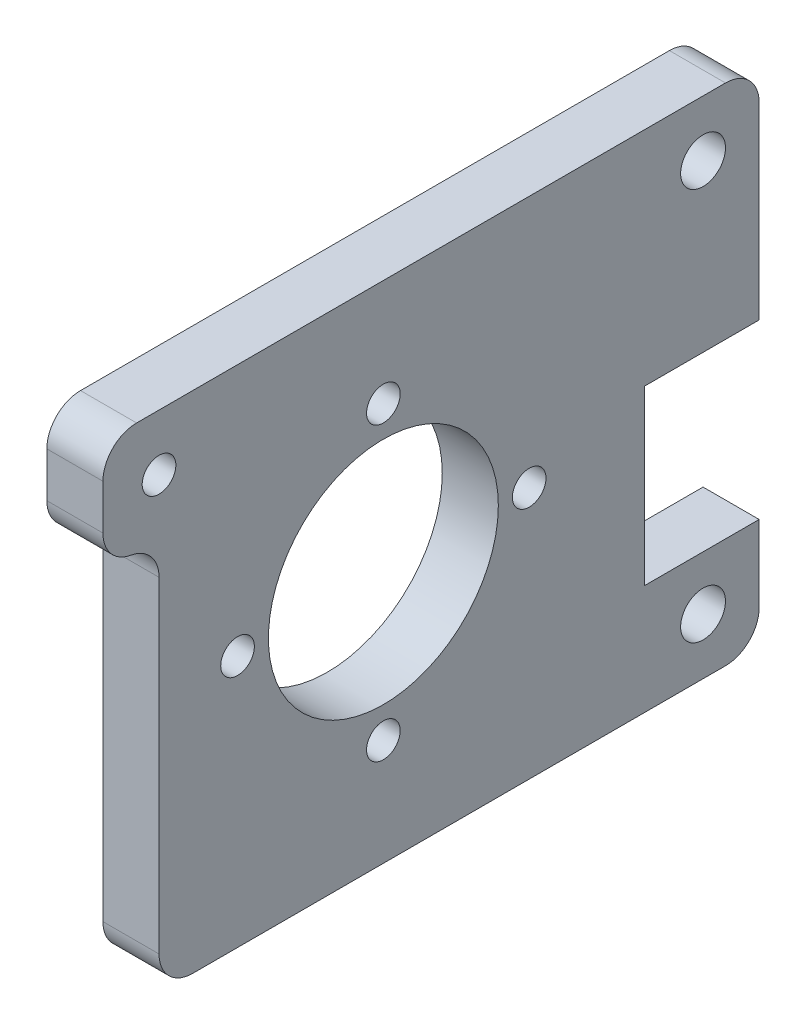
ISO-10303-21;
HEADER;
FILE_DESCRIPTION(('STEP AP214'),'2;1');
FILE_NAME('part.step','',(''),(''),'','','');
FILE_SCHEMA(('AUTOMOTIVE_DESIGN { 1 0 10303 214 1 1 1 1 }'));
ENDSEC;
DATA;
#1=APPLICATION_CONTEXT('core data for automotive mechanical design processes');
#2=APPLICATION_PROTOCOL_DEFINITION('international standard','automotive_design',2000,#1);
#3=PRODUCT_CONTEXT('',#1,'mechanical');
#4=PRODUCT('Part','Part','',(#3));
#5=PRODUCT_RELATED_PRODUCT_CATEGORY('part','',(#4));
#6=PRODUCT_DEFINITION_FORMATION('','',#4);
#7=PRODUCT_DEFINITION_CONTEXT('part definition',#1,'design');
#8=PRODUCT_DEFINITION('design','',#6,#7);
#9=PRODUCT_DEFINITION_SHAPE('','',#8);
#10=(LENGTH_UNIT() NAMED_UNIT(*) SI_UNIT(.MILLI.,.METRE.));
#11=(NAMED_UNIT(*) PLANE_ANGLE_UNIT() SI_UNIT($,.RADIAN.));
#12=(NAMED_UNIT(*) SI_UNIT($,.STERADIAN.) SOLID_ANGLE_UNIT());
#13=UNCERTAINTY_MEASURE_WITH_UNIT(LENGTH_MEASURE(1.E-05),#10,'distance_accuracy_value','');
#14=(GEOMETRIC_REPRESENTATION_CONTEXT(3) GLOBAL_UNCERTAINTY_ASSIGNED_CONTEXT((#13)) GLOBAL_UNIT_ASSIGNED_CONTEXT((#10,
#11,#12)) REPRESENTATION_CONTEXT('',''));
#15=CARTESIAN_POINT('',(0.,0.,0.));
#16=DIRECTION('',(0.,0.,1.));
#17=DIRECTION('',(1.,0.,0.));
#18=AXIS2_PLACEMENT_3D('',#15,#16,#17);
#19=CARTESIAN_POINT('',(5.,-22.5,-26.75));
#20=DIRECTION('',(0.,0.,1.));
#21=DIRECTION('',(1.,0.,0.));
#22=AXIS2_PLACEMENT_3D('',#19,#20,#21);
#23=PLANE('',#22);
#24=DIRECTION('',(0.,1.,0.));
#25=VECTOR('',#24,1.);
#26=CARTESIAN_POINT('',(5.,-22.5,-26.75));
#27=LINE('',#26,#25);
#28=CARTESIAN_POINT('',(5.,-19.5,-26.75));
#29=VERTEX_POINT('',#28);
#30=CARTESIAN_POINT('',(5.,-12.7,-26.75));
#31=VERTEX_POINT('',#30);
#32=EDGE_CURVE('E228',#29,#31,#27,.T.);
#33=ORIENTED_EDGE('',*,*,#32,.F.);
#34=DIRECTION('',(-1.,0.,0.));
#35=VECTOR('',#34,1.);
#36=CARTESIAN_POINT('',(5.,-19.5,-26.75));
#37=LINE('',#36,#35);
#38=CARTESIAN_POINT('',(0.,-19.5,-26.75));
#39=VERTEX_POINT('',#38);
#40=EDGE_CURVE('E283',#29,#39,#37,.T.);
#41=ORIENTED_EDGE('',*,*,#40,.T.);
#42=DIRECTION('',(0.,1.,0.));
#43=VECTOR('',#42,1.);
#44=CARTESIAN_POINT('',(0.,-22.5,-26.75));
#45=LINE('',#44,#43);
#46=CARTESIAN_POINT('',(0.,-12.7,-26.75));
#47=VERTEX_POINT('',#46);
#48=EDGE_CURVE('E240',#39,#47,#45,.T.);
#49=ORIENTED_EDGE('',*,*,#48,.T.);
#50=DIRECTION('',(1.,0.,0.));
#51=VECTOR('',#50,1.);
#52=CARTESIAN_POINT('',(5.,-12.7,-26.75));
#53=LINE('',#52,#51);
#54=EDGE_CURVE('E251',#47,#31,#53,.T.);
#55=ORIENTED_EDGE('',*,*,#54,.T.);
#56=EDGE_LOOP('',(#33,#41,#49,#55));
#57=FACE_BOUND('',#56,.T.);
#58=ADVANCED_FACE('F35',(#57),#23,.F.);
#59=CARTESIAN_POINT('',(5.,-22.5,26.75));
#60=DIRECTION('',(0.,0.,-1.));
#61=DIRECTION('',(-1.,0.,0.));
#62=AXIS2_PLACEMENT_3D('',#59,#60,#61);
#63=PLANE('',#62);
#64=DIRECTION('',(0.,-1.,0.));
#65=VECTOR('',#64,1.);
#66=CARTESIAN_POINT('',(5.,-22.5,26.75));
#67=LINE('',#66,#65);
#68=CARTESIAN_POINT('',(5.,9.58392021690037,26.75));
#69=VERTEX_POINT('',#68);
#70=CARTESIAN_POINT('',(5.,-19.5,26.75));
#71=VERTEX_POINT('',#70);
#72=EDGE_CURVE('E234',#69,#71,#67,.T.);
#73=ORIENTED_EDGE('',*,*,#72,.F.);
#74=DIRECTION('',(1.,0.,0.));
#75=VECTOR('',#74,1.);
#76=CARTESIAN_POINT('',(5.,9.58392021690039,26.75));
#77=LINE('',#76,#75);
#78=CARTESIAN_POINT('',(0.,9.58392021690037,26.75));
#79=VERTEX_POINT('',#78);
#80=EDGE_CURVE('E56',#69,#79,#77,.F.);
#81=ORIENTED_EDGE('',*,*,#80,.T.);
#82=DIRECTION('',(0.,-1.,0.));
#83=VECTOR('',#82,1.);
#84=CARTESIAN_POINT('',(0.,-22.5,26.75));
#85=LINE('',#84,#83);
#86=CARTESIAN_POINT('',(0.,-19.5,26.75));
#87=VERTEX_POINT('',#86);
#88=EDGE_CURVE('E245',#79,#87,#85,.T.);
#89=ORIENTED_EDGE('',*,*,#88,.T.);
#90=DIRECTION('',(-1.,0.,0.));
#91=VECTOR('',#90,1.);
#92=CARTESIAN_POINT('',(5.,-19.5,26.75));
#93=LINE('',#92,#91);
#94=EDGE_CURVE('E291',#87,#71,#93,.F.);
#95=ORIENTED_EDGE('',*,*,#94,.T.);
#96=EDGE_LOOP('',(#73,#81,#89,#95));
#97=FACE_BOUND('',#96,.T.);
#98=ADVANCED_FACE('F358',(#97),#63,.F.);
#99=CARTESIAN_POINT('',(5.,0.,0.));
#100=DIRECTION('',(-1.,0.,0.));
#101=DIRECTION('',(0.,0.,1.));
#102=AXIS2_PLACEMENT_3D('',#99,#100,#101);
#103=PLANE('',#102);
#104=CARTESIAN_POINT('',(5.,17.5,26.75));
#105=DIRECTION('',(1.,0.,0.));
#106=DIRECTION('',(0.,0.,-1.));
#107=AXIS2_PLACEMENT_3D('',#104,#105,#106);
#108=CIRCLE('',#107,1.5);
#109=CARTESIAN_POINT('',(5.,17.5,25.25));
#110=VERTEX_POINT('',#109);
#111=EDGE_CURVE('E172',#110,#110,#108,.T.);
#112=ORIENTED_EDGE('',*,*,#111,.F.);
#113=EDGE_LOOP('',(#112));
#114=FACE_BOUND('',#113,.T.);
#115=CARTESIAN_POINT('',(5.,2.7,-26.75));
#116=VERTEX_POINT('',#115);
#117=CARTESIAN_POINT('',(5.,19.5,-26.75));
#118=VERTEX_POINT('',#117);
#119=EDGE_CURVE('E231',#116,#118,#27,.T.);
#120=ORIENTED_EDGE('',*,*,#119,.T.);
#121=CARTESIAN_POINT('',(5.,19.5,-23.75));
#122=DIRECTION('',(-1.,0.,0.));
#123=DIRECTION('',(0.,0.,1.));
#124=AXIS2_PLACEMENT_3D('',#121,#122,#123);
#125=CIRCLE('',#124,3.);
#126=CARTESIAN_POINT('',(5.,22.5,-23.75));
#127=VERTEX_POINT('',#126);
#128=EDGE_CURVE('E281',#118,#127,#125,.F.);
#129=ORIENTED_EDGE('',*,*,#128,.T.);
#130=DIRECTION('',(0.,0.,1.));
#131=VECTOR('',#130,1.);
#132=CARTESIAN_POINT('',(5.,22.5,26.75));
#133=LINE('',#132,#131);
#134=CARTESIAN_POINT('',(5.,22.5,28.75));
#135=VERTEX_POINT('',#134);
#136=EDGE_CURVE('E230',#127,#135,#133,.T.);
#137=ORIENTED_EDGE('',*,*,#136,.T.);
#138=CARTESIAN_POINT('',(5.,19.5,28.75));
#139=DIRECTION('',(-1.,0.,0.));
#140=DIRECTION('',(0.,0.,1.));
#141=AXIS2_PLACEMENT_3D('',#138,#139,#140);
#142=CIRCLE('',#141,3.);
#143=CARTESIAN_POINT('',(5.,19.5,31.75));
#144=VERTEX_POINT('',#143);
#145=EDGE_CURVE('E273',#135,#144,#142,.F.);
#146=ORIENTED_EDGE('',*,*,#145,.T.);
#147=DIRECTION('',(0.,-1.,0.));
#148=VECTOR('',#147,1.);
#149=CARTESIAN_POINT('',(5.,12.5,31.75));
#150=LINE('',#149,#148);
#151=CARTESIAN_POINT('',(5.,15.5,31.75));
#152=VERTEX_POINT('',#151);
#153=EDGE_CURVE('E179',#144,#152,#150,.T.);
#154=ORIENTED_EDGE('',*,*,#153,.T.);
#155=CARTESIAN_POINT('',(5.,15.5,28.75));
#156=DIRECTION('',(-1.,0.,0.));
#157=DIRECTION('',(0.,0.,1.));
#158=AXIS2_PLACEMENT_3D('',#155,#156,#157);
#159=CIRCLE('',#158,3.);
#160=CARTESIAN_POINT('',(5.,12.5419601084502,29.25));
#161=VERTEX_POINT('',#160);
#162=EDGE_CURVE('E275',#152,#161,#159,.F.);
#163=ORIENTED_EDGE('',*,*,#162,.T.);
#164=CARTESIAN_POINT('',(5.,9.58392021690039,29.75));
#165=DIRECTION('',(-1.,0.,0.));
#166=DIRECTION('',(0.,0.,1.));
#167=AXIS2_PLACEMENT_3D('',#164,#165,#166);
#168=CIRCLE('',#167,3.);
#169=EDGE_CURVE('E43',#161,#69,#168,.T.);
#170=ORIENTED_EDGE('',*,*,#169,.T.);
#171=ORIENTED_EDGE('',*,*,#72,.T.);
#172=CARTESIAN_POINT('',(5.,-19.5,23.75));
#173=DIRECTION('',(-1.,0.,0.));
#174=DIRECTION('',(0.,0.,1.));
#175=AXIS2_PLACEMENT_3D('',#172,#173,#174);
#176=CIRCLE('',#175,3.);
#177=CARTESIAN_POINT('',(5.,-22.5,23.75));
#178=VERTEX_POINT('',#177);
#179=EDGE_CURVE('E277',#71,#178,#176,.F.);
#180=ORIENTED_EDGE('',*,*,#179,.T.);
#181=DIRECTION('',(0.,0.,-1.));
#182=VECTOR('',#181,1.);
#183=CARTESIAN_POINT('',(5.,-22.5,26.75));
#184=LINE('',#183,#182);
#185=CARTESIAN_POINT('',(5.,-22.5,-23.75));
#186=VERTEX_POINT('',#185);
#187=EDGE_CURVE('E236',#178,#186,#184,.T.);
#188=ORIENTED_EDGE('',*,*,#187,.T.);
#189=CARTESIAN_POINT('',(5.,-19.5,-23.75));
#190=DIRECTION('',(-1.,0.,0.));
#191=DIRECTION('',(0.,0.,1.));
#192=AXIS2_PLACEMENT_3D('',#189,#190,#191);
#193=CIRCLE('',#192,3.);
#194=EDGE_CURVE('E279',#186,#29,#193,.F.);
#195=ORIENTED_EDGE('',*,*,#194,.T.);
#196=ORIENTED_EDGE('',*,*,#32,.T.);
#197=DIRECTION('',(0.,0.,-1.));
#198=VECTOR('',#197,1.);
#199=CARTESIAN_POINT('',(5.,-12.7,-16.55));
#200=LINE('',#199,#198);
#201=CARTESIAN_POINT('',(5.,-12.7,-16.55));
#202=VERTEX_POINT('',#201);
#203=EDGE_CURVE('E166',#202,#31,#200,.T.);
#204=ORIENTED_EDGE('',*,*,#203,.F.);
#205=DIRECTION('',(0.,-1.,0.));
#206=VECTOR('',#205,1.);
#207=CARTESIAN_POINT('',(5.,-12.7,-16.55));
#208=LINE('',#207,#206);
#209=CARTESIAN_POINT('',(5.,2.7,-16.55));
#210=VERTEX_POINT('',#209);
#211=EDGE_CURVE('E169',#210,#202,#208,.T.);
#212=ORIENTED_EDGE('',*,*,#211,.F.);
#213=DIRECTION('',(0.,0.,1.));
#214=VECTOR('',#213,1.);
#215=CARTESIAN_POINT('',(5.,2.7,-16.55));
#216=LINE('',#215,#214);
#217=EDGE_CURVE('E146',#116,#210,#216,.T.);
#218=ORIENTED_EDGE('',*,*,#217,.F.);
#219=EDGE_LOOP('',(#120,#129,#137,#146,#154,#163,#170,#171,#180,#188,#195,#196,#204,#212,#218));
#220=FACE_BOUND('',#219,.T.);
#221=CARTESIAN_POINT('',(5.,0.,6.75000000000001));
#222=DIRECTION('',(1.,0.,0.));
#223=DIRECTION('',(0.,0.,-1.));
#224=AXIS2_PLACEMENT_3D('',#221,#222,#223);
#225=CIRCLE('',#224,10.25);
#226=CARTESIAN_POINT('',(5.,0.,-3.49999999999999));
#227=VERTEX_POINT('',#226);
#228=EDGE_CURVE('E223',#227,#227,#225,.T.);
#229=ORIENTED_EDGE('',*,*,#228,.F.);
#230=EDGE_LOOP('',(#229));
#231=FACE_BOUND('',#230,.T.);
#232=CARTESIAN_POINT('',(5.,0.,-6.24999999999999));
#233=DIRECTION('',(1.,0.,0.));
#234=DIRECTION('',(0.,0.,-1.));
#235=AXIS2_PLACEMENT_3D('',#232,#233,#234);
#236=CIRCLE('',#235,1.5);
#237=CARTESIAN_POINT('',(5.,0.,-7.74999999999999));
#238=VERTEX_POINT('',#237);
#239=EDGE_CURVE('E217',#238,#238,#236,.T.);
#240=ORIENTED_EDGE('',*,*,#239,.F.);
#241=EDGE_LOOP('',(#240));
#242=FACE_BOUND('',#241,.T.);
#243=CARTESIAN_POINT('',(5.,0.,19.75));
#244=DIRECTION('',(1.,0.,0.));
#245=DIRECTION('',(0.,0.,1.));
#246=AXIS2_PLACEMENT_3D('',#243,#244,#245);
#247=CIRCLE('',#246,1.5);
#248=CARTESIAN_POINT('',(5.,0.,21.25));
#249=VERTEX_POINT('',#248);
#250=EDGE_CURVE('E211',#249,#249,#247,.T.);
#251=ORIENTED_EDGE('',*,*,#250,.F.);
#252=EDGE_LOOP('',(#251));
#253=FACE_BOUND('',#252,.T.);
#254=CARTESIAN_POINT('',(5.,13.,6.75000000000001));
#255=DIRECTION('',(1.,0.,0.));
#256=DIRECTION('',(0.,0.,-1.));
#257=AXIS2_PLACEMENT_3D('',#254,#255,#256);
#258=CIRCLE('',#257,1.5);
#259=CARTESIAN_POINT('',(5.,13.,5.25000000000001));
#260=VERTEX_POINT('',#259);
#261=EDGE_CURVE('E205',#260,#260,#258,.T.);
#262=ORIENTED_EDGE('',*,*,#261,.F.);
#263=EDGE_LOOP('',(#262));
#264=FACE_BOUND('',#263,.T.);
#265=CARTESIAN_POINT('',(5.,17.5,-21.75));
#266=DIRECTION('',(1.,0.,0.));
#267=DIRECTION('',(0.,0.,-1.));
#268=AXIS2_PLACEMENT_3D('',#265,#266,#267);
#269=CIRCLE('',#268,2.00000000000001);
#270=CARTESIAN_POINT('',(5.,17.5,-23.75));
#271=VERTEX_POINT('',#270);
#272=EDGE_CURVE('E199',#271,#271,#269,.T.);
#273=ORIENTED_EDGE('',*,*,#272,.F.);
#274=EDGE_LOOP('',(#273));
#275=FACE_BOUND('',#274,.T.);
#276=CARTESIAN_POINT('',(5.,-17.5,-21.75));
#277=DIRECTION('',(1.,0.,0.));
#278=DIRECTION('',(0.,0.,1.));
#279=AXIS2_PLACEMENT_3D('',#276,#277,#278);
#280=CIRCLE('',#279,2.00000000000001);
#281=CARTESIAN_POINT('',(5.,-17.5,-19.75));
#282=VERTEX_POINT('',#281);
#283=EDGE_CURVE('E193',#282,#282,#280,.T.);
#284=ORIENTED_EDGE('',*,*,#283,.F.);
#285=EDGE_LOOP('',(#284));
#286=FACE_BOUND('',#285,.T.);
#287=CARTESIAN_POINT('',(5.,-13.,6.75000000000001));
#288=DIRECTION('',(1.,0.,0.));
#289=DIRECTION('',(0.,0.,1.));
#290=AXIS2_PLACEMENT_3D('',#287,#288,#289);
#291=CIRCLE('',#290,1.5);
#292=CARTESIAN_POINT('',(5.,-13.,8.25000000000001));
#293=VERTEX_POINT('',#292);
#294=EDGE_CURVE('E187',#293,#293,#291,.T.);
#295=ORIENTED_EDGE('',*,*,#294,.F.);
#296=EDGE_LOOP('',(#295));
#297=FACE_BOUND('',#296,.T.);
#298=ADVANCED_FACE('F310',(#114,#220,#231,#242,#253,#264,#275,#286,#297),#103,.F.);
#299=CARTESIAN_POINT('',(0.,0.,0.));
#300=DIRECTION('',(-1.,0.,0.));
#301=DIRECTION('',(0.,0.,1.));
#302=AXIS2_PLACEMENT_3D('',#299,#300,#301);
#303=PLANE('',#302);
#304=CARTESIAN_POINT('',(0.,17.5,26.75));
#305=DIRECTION('',(1.,0.,0.));
#306=DIRECTION('',(0.,0.,-1.));
#307=AXIS2_PLACEMENT_3D('',#304,#305,#306);
#308=CIRCLE('',#307,1.5);
#309=CARTESIAN_POINT('',(0.,17.5,25.25));
#310=VERTEX_POINT('',#309);
#311=EDGE_CURVE('E183',#310,#310,#308,.T.);
#312=ORIENTED_EDGE('',*,*,#311,.T.);
#313=EDGE_LOOP('',(#312));
#314=FACE_BOUND('',#313,.T.);
#315=DIRECTION('',(0.,0.,1.));
#316=VECTOR('',#315,1.);
#317=CARTESIAN_POINT('',(0.,22.5,26.75));
#318=LINE('',#317,#316);
#319=CARTESIAN_POINT('',(0.,22.5,-23.75));
#320=VERTEX_POINT('',#319);
#321=CARTESIAN_POINT('',(0.,22.5,28.75));
#322=VERTEX_POINT('',#321);
#323=EDGE_CURVE('E242',#320,#322,#318,.T.);
#324=ORIENTED_EDGE('',*,*,#323,.F.);
#325=CARTESIAN_POINT('',(0.,19.5,-23.75));
#326=DIRECTION('',(-1.,0.,0.));
#327=DIRECTION('',(0.,0.,1.));
#328=AXIS2_PLACEMENT_3D('',#325,#326,#327);
#329=CIRCLE('',#328,3.);
#330=CARTESIAN_POINT('',(0.,19.5,-26.75));
#331=VERTEX_POINT('',#330);
#332=EDGE_CURVE('E269',#320,#331,#329,.T.);
#333=ORIENTED_EDGE('',*,*,#332,.T.);
#334=CARTESIAN_POINT('',(0.,2.69999999999999,-26.75));
#335=VERTEX_POINT('',#334);
#336=EDGE_CURVE('E165',#335,#331,#45,.T.);
#337=ORIENTED_EDGE('',*,*,#336,.F.);
#338=DIRECTION('',(0.,0.,1.));
#339=VECTOR('',#338,1.);
#340=CARTESIAN_POINT('',(0.,2.7,-16.55));
#341=LINE('',#340,#339);
#342=CARTESIAN_POINT('',(0.,2.7,-16.55));
#343=VERTEX_POINT('',#342);
#344=EDGE_CURVE('E143',#335,#343,#341,.T.);
#345=ORIENTED_EDGE('',*,*,#344,.T.);
#346=DIRECTION('',(0.,-1.,0.));
#347=VECTOR('',#346,1.);
#348=CARTESIAN_POINT('',(0.,-12.7,-16.55));
#349=LINE('',#348,#347);
#350=CARTESIAN_POINT('',(0.,-12.7,-16.55));
#351=VERTEX_POINT('',#350);
#352=EDGE_CURVE('E154',#343,#351,#349,.T.);
#353=ORIENTED_EDGE('',*,*,#352,.T.);
#354=DIRECTION('',(0.,0.,-1.));
#355=VECTOR('',#354,1.);
#356=CARTESIAN_POINT('',(0.,-12.7,-16.55));
#357=LINE('',#356,#355);
#358=EDGE_CURVE('E151',#351,#47,#357,.T.);
#359=ORIENTED_EDGE('',*,*,#358,.T.);
#360=ORIENTED_EDGE('',*,*,#48,.F.);
#361=CARTESIAN_POINT('',(0.,-19.5,-23.75));
#362=DIRECTION('',(-1.,0.,0.));
#363=DIRECTION('',(0.,0.,1.));
#364=AXIS2_PLACEMENT_3D('',#361,#362,#363);
#365=CIRCLE('',#364,3.);
#366=CARTESIAN_POINT('',(0.,-22.5,-23.75));
#367=VERTEX_POINT('',#366);
#368=EDGE_CURVE('E267',#39,#367,#365,.T.);
#369=ORIENTED_EDGE('',*,*,#368,.T.);
#370=DIRECTION('',(0.,0.,-1.));
#371=VECTOR('',#370,1.);
#372=CARTESIAN_POINT('',(0.,-22.5,26.75));
#373=LINE('',#372,#371);
#374=CARTESIAN_POINT('',(0.,-22.5,23.75));
#375=VERTEX_POINT('',#374);
#376=EDGE_CURVE('E247',#375,#367,#373,.T.);
#377=ORIENTED_EDGE('',*,*,#376,.F.);
#378=CARTESIAN_POINT('',(0.,-19.5,23.75));
#379=DIRECTION('',(-1.,0.,0.));
#380=DIRECTION('',(0.,0.,1.));
#381=AXIS2_PLACEMENT_3D('',#378,#379,#380);
#382=CIRCLE('',#381,3.);
#383=EDGE_CURVE('E264',#375,#87,#382,.T.);
#384=ORIENTED_EDGE('',*,*,#383,.T.);
#385=ORIENTED_EDGE('',*,*,#88,.F.);
#386=CARTESIAN_POINT('',(0.,9.58392021690039,29.75));
#387=DIRECTION('',(-1.,0.,0.));
#388=DIRECTION('',(0.,0.,1.));
#389=AXIS2_PLACEMENT_3D('',#386,#387,#388);
#390=CIRCLE('',#389,3.);
#391=CARTESIAN_POINT('',(0.,12.5419601084502,29.25));
#392=VERTEX_POINT('',#391);
#393=EDGE_CURVE('E11',#79,#392,#390,.F.);
#394=ORIENTED_EDGE('',*,*,#393,.T.);
#395=CARTESIAN_POINT('',(0.,15.5,28.75));
#396=DIRECTION('',(-1.,0.,0.));
#397=DIRECTION('',(0.,0.,1.));
#398=AXIS2_PLACEMENT_3D('',#395,#396,#397);
#399=CIRCLE('',#398,3.);
#400=CARTESIAN_POINT('',(0.,15.5,31.75));
#401=VERTEX_POINT('',#400);
#402=EDGE_CURVE('E262',#392,#401,#399,.T.);
#403=ORIENTED_EDGE('',*,*,#402,.T.);
#404=DIRECTION('',(0.,-1.,0.));
#405=VECTOR('',#404,1.);
#406=CARTESIAN_POINT('',(0.,12.5,31.75));
#407=LINE('',#406,#405);
#408=CARTESIAN_POINT('',(0.,19.5,31.75));
#409=VERTEX_POINT('',#408);
#410=EDGE_CURVE('E182',#409,#401,#407,.T.);
#411=ORIENTED_EDGE('',*,*,#410,.F.);
#412=CARTESIAN_POINT('',(0.,19.5,28.75));
#413=DIRECTION('',(-1.,0.,0.));
#414=DIRECTION('',(0.,0.,1.));
#415=AXIS2_PLACEMENT_3D('',#412,#413,#414);
#416=CIRCLE('',#415,3.);
#417=EDGE_CURVE('E260',#409,#322,#416,.T.);
#418=ORIENTED_EDGE('',*,*,#417,.T.);
#419=EDGE_LOOP('',(#324,#333,#337,#345,#353,#359,#360,#369,#377,#384,#385,#394,#403,#411,#418));
#420=FACE_BOUND('',#419,.T.);
#421=CARTESIAN_POINT('',(0.,-17.5,-21.75));
#422=DIRECTION('',(1.,0.,0.));
#423=DIRECTION('',(0.,0.,1.));
#424=AXIS2_PLACEMENT_3D('',#421,#422,#423);
#425=CIRCLE('',#424,2.00000000000001);
#426=CARTESIAN_POINT('',(0.,-17.5,-19.75));
#427=VERTEX_POINT('',#426);
#428=EDGE_CURVE('E190',#427,#427,#425,.T.);
#429=ORIENTED_EDGE('',*,*,#428,.T.);
#430=EDGE_LOOP('',(#429));
#431=FACE_BOUND('',#430,.T.);
#432=CARTESIAN_POINT('',(0.,13.,6.75000000000001));
#433=DIRECTION('',(1.,0.,0.));
#434=DIRECTION('',(0.,0.,-1.));
#435=AXIS2_PLACEMENT_3D('',#432,#433,#434);
#436=CIRCLE('',#435,1.5);
#437=CARTESIAN_POINT('',(0.,13.,5.25000000000001));
#438=VERTEX_POINT('',#437);
#439=EDGE_CURVE('E202',#438,#438,#436,.T.);
#440=ORIENTED_EDGE('',*,*,#439,.T.);
#441=EDGE_LOOP('',(#440));
#442=FACE_BOUND('',#441,.T.);
#443=CARTESIAN_POINT('',(0.,0.,-6.24999999999999));
#444=DIRECTION('',(1.,0.,0.));
#445=DIRECTION('',(0.,0.,-1.));
#446=AXIS2_PLACEMENT_3D('',#443,#444,#445);
#447=CIRCLE('',#446,1.5);
#448=CARTESIAN_POINT('',(0.,0.,-7.74999999999999));
#449=VERTEX_POINT('',#448);
#450=EDGE_CURVE('E214',#449,#449,#447,.T.);
#451=ORIENTED_EDGE('',*,*,#450,.T.);
#452=EDGE_LOOP('',(#451));
#453=FACE_BOUND('',#452,.T.);
#454=CARTESIAN_POINT('',(0.,0.,6.75000000000001));
#455=DIRECTION('',(1.,0.,0.));
#456=DIRECTION('',(0.,0.,-1.));
#457=AXIS2_PLACEMENT_3D('',#454,#455,#456);
#458=CIRCLE('',#457,10.25);
#459=CARTESIAN_POINT('',(0.,0.,-3.49999999999999));
#460=VERTEX_POINT('',#459);
#461=EDGE_CURVE('E220',#460,#460,#458,.T.);
#462=ORIENTED_EDGE('',*,*,#461,.T.);
#463=EDGE_LOOP('',(#462));
#464=FACE_BOUND('',#463,.T.);
#465=CARTESIAN_POINT('',(0.,0.,19.75));
#466=DIRECTION('',(1.,0.,0.));
#467=DIRECTION('',(0.,0.,1.));
#468=AXIS2_PLACEMENT_3D('',#465,#466,#467);
#469=CIRCLE('',#468,1.5);
#470=CARTESIAN_POINT('',(0.,0.,21.25));
#471=VERTEX_POINT('',#470);
#472=EDGE_CURVE('E208',#471,#471,#469,.T.);
#473=ORIENTED_EDGE('',*,*,#472,.T.);
#474=EDGE_LOOP('',(#473));
#475=FACE_BOUND('',#474,.T.);
#476=CARTESIAN_POINT('',(0.,17.5,-21.75));
#477=DIRECTION('',(1.,0.,0.));
#478=DIRECTION('',(0.,0.,-1.));
#479=AXIS2_PLACEMENT_3D('',#476,#477,#478);
#480=CIRCLE('',#479,2.00000000000001);
#481=CARTESIAN_POINT('',(0.,17.5,-23.75));
#482=VERTEX_POINT('',#481);
#483=EDGE_CURVE('E196',#482,#482,#480,.T.);
#484=ORIENTED_EDGE('',*,*,#483,.T.);
#485=EDGE_LOOP('',(#484));
#486=FACE_BOUND('',#485,.T.);
#487=CARTESIAN_POINT('',(0.,-13.,6.75000000000001));
#488=DIRECTION('',(1.,0.,0.));
#489=DIRECTION('',(0.,0.,1.));
#490=AXIS2_PLACEMENT_3D('',#487,#488,#489);
#491=CIRCLE('',#490,1.5);
#492=CARTESIAN_POINT('',(0.,-13.,8.25000000000001));
#493=VERTEX_POINT('',#492);
#494=EDGE_CURVE('E186',#493,#493,#491,.T.);
#495=ORIENTED_EDGE('',*,*,#494,.T.);
#496=EDGE_LOOP('',(#495));
#497=FACE_BOUND('',#496,.T.);
#498=ADVANCED_FACE('F162',(#314,#420,#431,#442,#453,#464,#475,#486,#497),#303,.T.);
#499=ORIENTED_EDGE('',*,*,#336,.T.);
#500=DIRECTION('',(-1.,0.,0.));
#501=VECTOR('',#500,1.);
#502=CARTESIAN_POINT('',(5.,19.5,-26.75));
#503=LINE('',#502,#501);
#504=EDGE_CURVE('E271',#331,#118,#503,.F.);
#505=ORIENTED_EDGE('',*,*,#504,.T.);
#506=ORIENTED_EDGE('',*,*,#119,.F.);
#507=DIRECTION('',(-1.,0.,0.));
#508=VECTOR('',#507,1.);
#509=CARTESIAN_POINT('',(5.,2.7,-26.75));
#510=LINE('',#509,#508);
#511=EDGE_CURVE('E239',#116,#335,#510,.T.);
#512=ORIENTED_EDGE('',*,*,#511,.T.);
#513=EDGE_LOOP('',(#499,#505,#506,#512));
#514=FACE_BOUND('',#513,.T.);
#515=ADVANCED_FACE('F330',(#514),#23,.F.);
#516=CARTESIAN_POINT('',(5.,22.5,26.75));
#517=DIRECTION('',(0.,-1.,0.));
#518=DIRECTION('',(0.,0.,-1.));
#519=AXIS2_PLACEMENT_3D('',#516,#517,#518);
#520=PLANE('',#519);
#521=ORIENTED_EDGE('',*,*,#136,.F.);
#522=DIRECTION('',(-1.,0.,0.));
#523=VECTOR('',#522,1.);
#524=CARTESIAN_POINT('',(5.,22.5,-23.75));
#525=LINE('',#524,#523);
#526=EDGE_CURVE('E257',#127,#320,#525,.T.);
#527=ORIENTED_EDGE('',*,*,#526,.T.);
#528=ORIENTED_EDGE('',*,*,#323,.T.);
#529=DIRECTION('',(1.,0.,0.));
#530=VECTOR('',#529,1.);
#531=CARTESIAN_POINT('',(5.,22.5,28.75));
#532=LINE('',#531,#530);
#533=EDGE_CURVE('E254',#322,#135,#532,.T.);
#534=ORIENTED_EDGE('',*,*,#533,.T.);
#535=EDGE_LOOP('',(#521,#527,#528,#534));
#536=FACE_BOUND('',#535,.T.);
#537=ADVANCED_FACE('F323',(#536),#520,.F.);
#538=CARTESIAN_POINT('',(5.,-22.5,26.75));
#539=DIRECTION('',(0.,1.,0.));
#540=DIRECTION('',(0.,0.,1.));
#541=AXIS2_PLACEMENT_3D('',#538,#539,#540);
#542=PLANE('',#541);
#543=ORIENTED_EDGE('',*,*,#376,.T.);
#544=DIRECTION('',(-1.,0.,0.));
#545=VECTOR('',#544,1.);
#546=CARTESIAN_POINT('',(5.,-22.5,-23.75));
#547=LINE('',#546,#545);
#548=EDGE_CURVE('E289',#367,#186,#547,.F.);
#549=ORIENTED_EDGE('',*,*,#548,.T.);
#550=ORIENTED_EDGE('',*,*,#187,.F.);
#551=DIRECTION('',(-1.,0.,0.));
#552=VECTOR('',#551,1.);
#553=CARTESIAN_POINT('',(5.,-22.5,23.75));
#554=LINE('',#553,#552);
#555=EDGE_CURVE('E286',#178,#375,#554,.T.);
#556=ORIENTED_EDGE('',*,*,#555,.T.);
#557=EDGE_LOOP('',(#543,#549,#550,#556));
#558=FACE_BOUND('',#557,.T.);
#559=ADVANCED_FACE('F344',(#558),#542,.F.);
#560=CARTESIAN_POINT('',(5.,0.,6.75000000000001));
#561=DIRECTION('',(-1.,0.,0.));
#562=DIRECTION('',(0.,0.,1.));
#563=AXIS2_PLACEMENT_3D('',#560,#561,#562);
#564=CYLINDRICAL_SURFACE('',#563,10.25);
#565=ORIENTED_EDGE('',*,*,#228,.T.);
#566=EDGE_LOOP('',(#565));
#567=FACE_BOUND('',#566,.T.);
#568=ORIENTED_EDGE('',*,*,#461,.F.);
#569=EDGE_LOOP('',(#568));
#570=FACE_BOUND('',#569,.T.);
#571=ADVANCED_FACE('F382',(#567,#570),#564,.F.);
#572=CARTESIAN_POINT('',(5.,0.,-6.24999999999999));
#573=DIRECTION('',(-1.,0.,0.));
#574=DIRECTION('',(0.,0.,1.));
#575=AXIS2_PLACEMENT_3D('',#572,#573,#574);
#576=CYLINDRICAL_SURFACE('',#575,1.5);
#577=ORIENTED_EDGE('',*,*,#239,.T.);
#578=EDGE_LOOP('',(#577));
#579=FACE_BOUND('',#578,.T.);
#580=ORIENTED_EDGE('',*,*,#450,.F.);
#581=EDGE_LOOP('',(#580));
#582=FACE_BOUND('',#581,.T.);
#583=ADVANCED_FACE('F386',(#579,#582),#576,.F.);
#584=CARTESIAN_POINT('',(5.,0.,19.75));
#585=DIRECTION('',(-1.,0.,0.));
#586=DIRECTION('',(0.,0.,1.));
#587=AXIS2_PLACEMENT_3D('',#584,#585,#586);
#588=CYLINDRICAL_SURFACE('',#587,1.5);
#589=ORIENTED_EDGE('',*,*,#250,.T.);
#590=EDGE_LOOP('',(#589));
#591=FACE_BOUND('',#590,.T.);
#592=ORIENTED_EDGE('',*,*,#472,.F.);
#593=EDGE_LOOP('',(#592));
#594=FACE_BOUND('',#593,.T.);
#595=ADVANCED_FACE('F391',(#591,#594),#588,.F.);
#596=CARTESIAN_POINT('',(5.,13.,6.75000000000001));
#597=DIRECTION('',(-1.,0.,0.));
#598=DIRECTION('',(0.,0.,1.));
#599=AXIS2_PLACEMENT_3D('',#596,#597,#598);
#600=CYLINDRICAL_SURFACE('',#599,1.5);
#601=ORIENTED_EDGE('',*,*,#261,.T.);
#602=EDGE_LOOP('',(#601));
#603=FACE_BOUND('',#602,.T.);
#604=ORIENTED_EDGE('',*,*,#439,.F.);
#605=EDGE_LOOP('',(#604));
#606=FACE_BOUND('',#605,.T.);
#607=ADVANCED_FACE('F398',(#603,#606),#600,.F.);
#608=CARTESIAN_POINT('',(5.,17.5,-21.75));
#609=DIRECTION('',(-1.,0.,0.));
#610=DIRECTION('',(0.,0.,1.));
#611=AXIS2_PLACEMENT_3D('',#608,#609,#610);
#612=CYLINDRICAL_SURFACE('',#611,2.00000000000001);
#613=ORIENTED_EDGE('',*,*,#272,.T.);
#614=EDGE_LOOP('',(#613));
#615=FACE_BOUND('',#614,.T.);
#616=ORIENTED_EDGE('',*,*,#483,.F.);
#617=EDGE_LOOP('',(#616));
#618=FACE_BOUND('',#617,.T.);
#619=ADVANCED_FACE('F402',(#615,#618),#612,.F.);
#620=CARTESIAN_POINT('',(5.,-17.5,-21.75));
#621=DIRECTION('',(-1.,0.,0.));
#622=DIRECTION('',(0.,0.,1.));
#623=AXIS2_PLACEMENT_3D('',#620,#621,#622);
#624=CYLINDRICAL_SURFACE('',#623,2.00000000000001);
#625=ORIENTED_EDGE('',*,*,#283,.T.);
#626=EDGE_LOOP('',(#625));
#627=FACE_BOUND('',#626,.T.);
#628=ORIENTED_EDGE('',*,*,#428,.F.);
#629=EDGE_LOOP('',(#628));
#630=FACE_BOUND('',#629,.T.);
#631=ADVANCED_FACE('F406',(#627,#630),#624,.F.);
#632=CARTESIAN_POINT('',(5.,-13.,6.75000000000001));
#633=DIRECTION('',(-1.,0.,0.));
#634=DIRECTION('',(0.,0.,1.));
#635=AXIS2_PLACEMENT_3D('',#632,#633,#634);
#636=CYLINDRICAL_SURFACE('',#635,1.5);
#637=ORIENTED_EDGE('',*,*,#294,.T.);
#638=EDGE_LOOP('',(#637));
#639=FACE_BOUND('',#638,.T.);
#640=ORIENTED_EDGE('',*,*,#494,.F.);
#641=EDGE_LOOP('',(#640));
#642=FACE_BOUND('',#641,.T.);
#643=ADVANCED_FACE('F410',(#639,#642),#636,.F.);
#644=CARTESIAN_POINT('',(-11.1803398874989,12.5,31.75));
#645=DIRECTION('',(0.,0.,1.));
#646=DIRECTION('',(1.,0.,0.));
#647=AXIS2_PLACEMENT_3D('',#644,#645,#646);
#648=PLANE('',#647);
#649=ORIENTED_EDGE('',*,*,#410,.T.);
#650=DIRECTION('',(1.,0.,0.));
#651=VECTOR('',#650,1.);
#652=CARTESIAN_POINT('',(-11.1803398874989,15.5,31.75));
#653=LINE('',#652,#651);
#654=EDGE_CURVE('E296',#401,#152,#653,.T.);
#655=ORIENTED_EDGE('',*,*,#654,.T.);
#656=ORIENTED_EDGE('',*,*,#153,.F.);
#657=DIRECTION('',(1.,0.,0.));
#658=VECTOR('',#657,1.);
#659=CARTESIAN_POINT('',(0.,19.5,31.75));
#660=LINE('',#659,#658);
#661=EDGE_CURVE('E294',#144,#409,#660,.F.);
#662=ORIENTED_EDGE('',*,*,#661,.T.);
#663=EDGE_LOOP('',(#649,#655,#656,#662));
#664=FACE_BOUND('',#663,.T.);
#665=ADVANCED_FACE('F315',(#664),#648,.T.);
#666=CARTESIAN_POINT('',(0.,-12.7,-16.55));
#667=DIRECTION('',(0.,-1.,0.));
#668=DIRECTION('',(0.,0.,-1.));
#669=AXIS2_PLACEMENT_3D('',#666,#667,#668);
#670=PLANE('',#669);
#671=ORIENTED_EDGE('',*,*,#358,.F.);
#672=DIRECTION('',(1.,0.,0.));
#673=VECTOR('',#672,1.);
#674=CARTESIAN_POINT('',(0.,-12.7,-16.55));
#675=LINE('',#674,#673);
#676=EDGE_CURVE('E150',#351,#202,#675,.T.);
#677=ORIENTED_EDGE('',*,*,#676,.T.);
#678=ORIENTED_EDGE('',*,*,#203,.T.);
#679=ORIENTED_EDGE('',*,*,#54,.F.);
#680=EDGE_LOOP('',(#671,#677,#678,#679));
#681=FACE_BOUND('',#680,.T.);
#682=ADVANCED_FACE('F336',(#681),#670,.F.);
#683=CARTESIAN_POINT('',(0.,2.7,-16.55));
#684=DIRECTION('',(0.,1.,0.));
#685=DIRECTION('',(0.,0.,1.));
#686=AXIS2_PLACEMENT_3D('',#683,#684,#685);
#687=PLANE('',#686);
#688=ORIENTED_EDGE('',*,*,#217,.T.);
#689=DIRECTION('',(1.,0.,0.));
#690=VECTOR('',#689,1.);
#691=CARTESIAN_POINT('',(0.,2.7,-16.55));
#692=LINE('',#691,#690);
#693=EDGE_CURVE('E139',#343,#210,#692,.T.);
#694=ORIENTED_EDGE('',*,*,#693,.F.);
#695=ORIENTED_EDGE('',*,*,#344,.F.);
#696=ORIENTED_EDGE('',*,*,#511,.F.);
#697=EDGE_LOOP('',(#688,#694,#695,#696));
#698=FACE_BOUND('',#697,.T.);
#699=ADVANCED_FACE('F141',(#698),#687,.F.);
#700=CARTESIAN_POINT('',(0.,-12.7,-16.55));
#701=DIRECTION('',(0.,0.,1.));
#702=DIRECTION('',(1.,0.,0.));
#703=AXIS2_PLACEMENT_3D('',#700,#701,#702);
#704=PLANE('',#703);
#705=ORIENTED_EDGE('',*,*,#211,.T.);
#706=ORIENTED_EDGE('',*,*,#676,.F.);
#707=ORIENTED_EDGE('',*,*,#352,.F.);
#708=ORIENTED_EDGE('',*,*,#693,.T.);
#709=EDGE_LOOP('',(#705,#706,#707,#708));
#710=FACE_BOUND('',#709,.T.);
#711=ADVANCED_FACE('F155',(#710),#704,.F.);
#712=CARTESIAN_POINT('',(0.,17.5,26.75));
#713=DIRECTION('',(1.,0.,0.));
#714=DIRECTION('',(0.,0.,-1.));
#715=AXIS2_PLACEMENT_3D('',#712,#713,#714);
#716=CYLINDRICAL_SURFACE('',#715,1.5);
#717=ORIENTED_EDGE('',*,*,#311,.F.);
#718=EDGE_LOOP('',(#717));
#719=FACE_BOUND('',#718,.T.);
#720=ORIENTED_EDGE('',*,*,#111,.T.);
#721=EDGE_LOOP('',(#720));
#722=FACE_BOUND('',#721,.T.);
#723=ADVANCED_FACE('F421',(#719,#722),#716,.F.);
#724=CARTESIAN_POINT('',(5.,19.5,-23.75));
#725=DIRECTION('',(-1.,0.,0.));
#726=DIRECTION('',(0.,0.,1.));
#727=AXIS2_PLACEMENT_3D('',#724,#725,#726);
#728=CYLINDRICAL_SURFACE('',#727,3.);
#729=ORIENTED_EDGE('',*,*,#128,.F.);
#730=ORIENTED_EDGE('',*,*,#504,.F.);
#731=ORIENTED_EDGE('',*,*,#332,.F.);
#732=ORIENTED_EDGE('',*,*,#526,.F.);
#733=EDGE_LOOP('',(#729,#730,#731,#732));
#734=FACE_BOUND('',#733,.T.);
#735=ADVANCED_FACE('F327',(#734),#728,.T.);
#736=CARTESIAN_POINT('',(5.,-19.5,-23.75));
#737=DIRECTION('',(-1.,0.,0.));
#738=DIRECTION('',(0.,0.,1.));
#739=AXIS2_PLACEMENT_3D('',#736,#737,#738);
#740=CYLINDRICAL_SURFACE('',#739,3.);
#741=ORIENTED_EDGE('',*,*,#194,.F.);
#742=ORIENTED_EDGE('',*,*,#548,.F.);
#743=ORIENTED_EDGE('',*,*,#368,.F.);
#744=ORIENTED_EDGE('',*,*,#40,.F.);
#745=EDGE_LOOP('',(#741,#742,#743,#744));
#746=FACE_BOUND('',#745,.T.);
#747=ADVANCED_FACE('F348',(#746),#740,.T.);
#748=CARTESIAN_POINT('',(5.,-19.5,23.75));
#749=DIRECTION('',(-1.,0.,0.));
#750=DIRECTION('',(0.,0.,1.));
#751=AXIS2_PLACEMENT_3D('',#748,#749,#750);
#752=CYLINDRICAL_SURFACE('',#751,3.);
#753=ORIENTED_EDGE('',*,*,#179,.F.);
#754=ORIENTED_EDGE('',*,*,#94,.F.);
#755=ORIENTED_EDGE('',*,*,#383,.F.);
#756=ORIENTED_EDGE('',*,*,#555,.F.);
#757=EDGE_LOOP('',(#753,#754,#755,#756));
#758=FACE_BOUND('',#757,.T.);
#759=ADVANCED_FACE('F351',(#758),#752,.T.);
#760=CARTESIAN_POINT('',(-11.1803398874989,15.5,28.75));
#761=DIRECTION('',(1.,0.,0.));
#762=DIRECTION('',(0.,0.,-1.));
#763=AXIS2_PLACEMENT_3D('',#760,#761,#762);
#764=CYLINDRICAL_SURFACE('',#763,3.);
#765=ORIENTED_EDGE('',*,*,#402,.F.);
#766=DIRECTION('',(1.,0.,0.));
#767=VECTOR('',#766,1.);
#768=CARTESIAN_POINT('',(-11.1803398874989,12.5419601084502,29.25));
#769=LINE('',#768,#767);
#770=EDGE_CURVE('E299',#392,#161,#769,.T.);
#771=ORIENTED_EDGE('',*,*,#770,.T.);
#772=ORIENTED_EDGE('',*,*,#162,.F.);
#773=ORIENTED_EDGE('',*,*,#654,.F.);
#774=EDGE_LOOP('',(#765,#771,#772,#773));
#775=FACE_BOUND('',#774,.T.);
#776=ADVANCED_FACE('F305',(#775),#764,.T.);
#777=CARTESIAN_POINT('',(5.,19.5,28.75));
#778=DIRECTION('',(-1.,0.,0.));
#779=DIRECTION('',(0.,0.,1.));
#780=AXIS2_PLACEMENT_3D('',#777,#778,#779);
#781=CYLINDRICAL_SURFACE('',#780,3.);
#782=ORIENTED_EDGE('',*,*,#417,.F.);
#783=ORIENTED_EDGE('',*,*,#661,.F.);
#784=ORIENTED_EDGE('',*,*,#145,.F.);
#785=ORIENTED_EDGE('',*,*,#533,.F.);
#786=EDGE_LOOP('',(#782,#783,#784,#785));
#787=FACE_BOUND('',#786,.T.);
#788=ADVANCED_FACE('F319',(#787),#781,.T.);
#789=CARTESIAN_POINT('',(-11.1803398874989,9.58392021690039,29.75));
#790=DIRECTION('',(1.,0.,0.));
#791=DIRECTION('',(0.,0.,-1.));
#792=AXIS2_PLACEMENT_3D('',#789,#790,#791);
#793=CYLINDRICAL_SURFACE('',#792,3.);
#794=ORIENTED_EDGE('',*,*,#393,.F.);
#795=ORIENTED_EDGE('',*,*,#80,.F.);
#796=ORIENTED_EDGE('',*,*,#169,.F.);
#797=ORIENTED_EDGE('',*,*,#770,.F.);
#798=EDGE_LOOP('',(#794,#795,#796,#797));
#799=FACE_BOUND('',#798,.T.);
#800=ADVANCED_FACE('F37',(#799),#793,.F.);
#801=CLOSED_SHELL('',(#58,#98,#298,#498,#515,#537,#559,#571,#583,#595,#607,#619,#631,#643,#665,
#682,#699,#711,#723,#735,#747,#759,#776,#788,#800));
#802=MANIFOLD_SOLID_BREP('B2',#801);
#803=ADVANCED_BREP_SHAPE_REPRESENTATION('',(#18,#802),#14);
#804=SHAPE_DEFINITION_REPRESENTATION(#9,#803);
ENDSEC;
END-ISO-10303-21;
